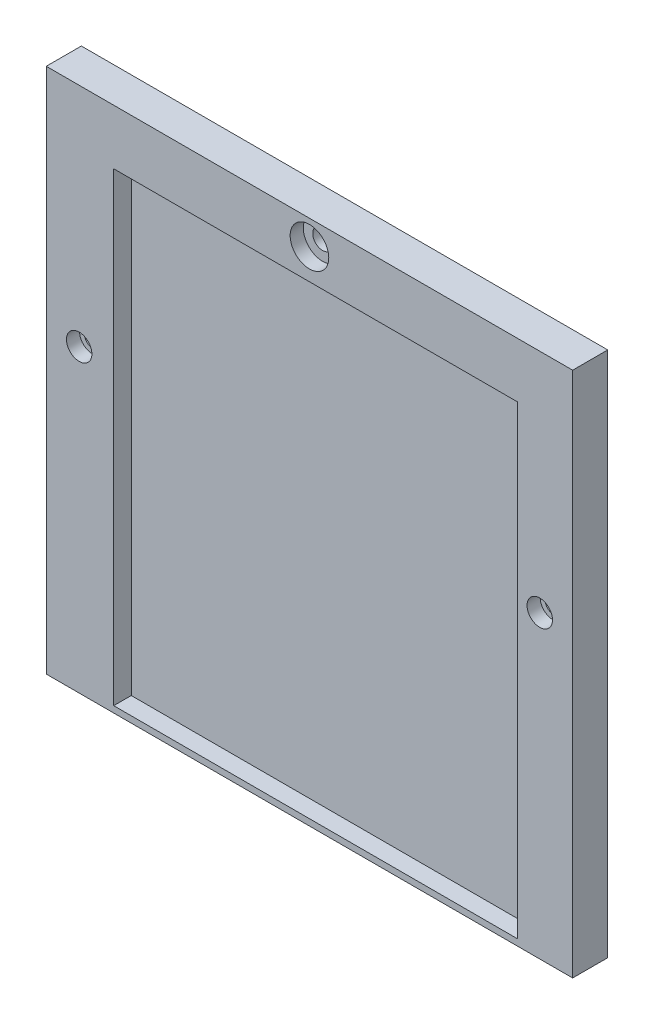
ISO-10303-21;
HEADER;
FILE_DESCRIPTION(('STEP AP214'),'2;1');
FILE_NAME('part.step','',(''),(''),'','','');
FILE_SCHEMA(('AUTOMOTIVE_DESIGN { 1 0 10303 214 1 1 1 1 }'));
ENDSEC;
DATA;
#1=APPLICATION_CONTEXT('core data for automotive mechanical design processes');
#2=APPLICATION_PROTOCOL_DEFINITION('international standard','automotive_design',2000,#1);
#3=PRODUCT_CONTEXT('',#1,'mechanical');
#4=PRODUCT('Part','Part','',(#3));
#5=PRODUCT_RELATED_PRODUCT_CATEGORY('part','',(#4));
#6=PRODUCT_DEFINITION_FORMATION('','',#4);
#7=PRODUCT_DEFINITION_CONTEXT('part definition',#1,'design');
#8=PRODUCT_DEFINITION('design','',#6,#7);
#9=PRODUCT_DEFINITION_SHAPE('','',#8);
#10=(LENGTH_UNIT() NAMED_UNIT(*) SI_UNIT(.MILLI.,.METRE.));
#11=(NAMED_UNIT(*) PLANE_ANGLE_UNIT() SI_UNIT($,.RADIAN.));
#12=(NAMED_UNIT(*) SI_UNIT($,.STERADIAN.) SOLID_ANGLE_UNIT());
#13=UNCERTAINTY_MEASURE_WITH_UNIT(LENGTH_MEASURE(1.E-05),#10,'distance_accuracy_value','');
#14=(GEOMETRIC_REPRESENTATION_CONTEXT(3) GLOBAL_UNCERTAINTY_ASSIGNED_CONTEXT((#13)) GLOBAL_UNIT_ASSIGNED_CONTEXT((#10,
#11,#12)) REPRESENTATION_CONTEXT('',''));
#15=CARTESIAN_POINT('',(0.,0.,0.));
#16=DIRECTION('',(0.,0.,1.));
#17=DIRECTION('',(1.,0.,0.));
#18=AXIS2_PLACEMENT_3D('',#15,#16,#17);
#19=CARTESIAN_POINT('',(-47.66,31.45,0.));
#20=DIRECTION('',(0.,0.,1.));
#21=DIRECTION('',(1.,0.,0.));
#22=AXIS2_PLACEMENT_3D('',#19,#20,#21);
#23=CYLINDRICAL_SURFACE('',#22,1.75);
#24=CARTESIAN_POINT('',(-47.66,31.45,0.));
#25=DIRECTION('',(0.,0.,1.));
#26=DIRECTION('',(1.,0.,0.));
#27=AXIS2_PLACEMENT_3D('',#24,#25,#26);
#28=CIRCLE('',#27,1.75);
#29=CARTESIAN_POINT('',(-45.91,31.45,0.));
#30=VERTEX_POINT('',#29);
#31=EDGE_CURVE('E159',#30,#30,#28,.T.);
#32=ORIENTED_EDGE('',*,*,#31,.F.);
#33=EDGE_LOOP('',(#32));
#34=FACE_BOUND('',#33,.T.);
#35=CARTESIAN_POINT('',(-47.66,31.45,5.));
#36=DIRECTION('',(0.,0.,1.));
#37=DIRECTION('',(1.,0.,0.));
#38=AXIS2_PLACEMENT_3D('',#35,#36,#37);
#39=CIRCLE('',#38,1.75);
#40=CARTESIAN_POINT('',(-45.91,31.45,5.));
#41=VERTEX_POINT('',#40);
#42=EDGE_CURVE('E43',#41,#41,#39,.F.);
#43=ORIENTED_EDGE('',*,*,#42,.F.);
#44=EDGE_LOOP('',(#43));
#45=FACE_BOUND('',#44,.T.);
#46=ADVANCED_FACE('F39',(#34,#45),#23,.F.);
#47=CARTESIAN_POINT('',(57.34,31.45,0.));
#48=DIRECTION('',(0.,0.,1.));
#49=DIRECTION('',(1.,0.,0.));
#50=AXIS2_PLACEMENT_3D('',#47,#48,#49);
#51=CYLINDRICAL_SURFACE('',#50,1.75);
#52=CARTESIAN_POINT('',(57.34,31.45,0.));
#53=DIRECTION('',(0.,0.,1.));
#54=DIRECTION('',(1.,0.,0.));
#55=AXIS2_PLACEMENT_3D('',#52,#53,#54);
#56=CIRCLE('',#55,1.75);
#57=CARTESIAN_POINT('',(59.09,31.45,0.));
#58=VERTEX_POINT('',#57);
#59=EDGE_CURVE('E169',#58,#58,#56,.T.);
#60=ORIENTED_EDGE('',*,*,#59,.F.);
#61=EDGE_LOOP('',(#60));
#62=FACE_BOUND('',#61,.T.);
#63=CARTESIAN_POINT('',(57.34,31.45,5.));
#64=DIRECTION('',(0.,0.,1.));
#65=DIRECTION('',(1.,0.,0.));
#66=AXIS2_PLACEMENT_3D('',#63,#64,#65);
#67=CIRCLE('',#66,1.75);
#68=CARTESIAN_POINT('',(59.09,31.45,5.));
#69=VERTEX_POINT('',#68);
#70=EDGE_CURVE('E166',#69,#69,#67,.F.);
#71=ORIENTED_EDGE('',*,*,#70,.F.);
#72=EDGE_LOOP('',(#71));
#73=FACE_BOUND('',#72,.T.);
#74=ADVANCED_FACE('F208',(#62,#73),#51,.F.);
#75=CARTESIAN_POINT('',(4.83805461554325,77.4543242444479,0.));
#76=DIRECTION('',(0.,0.,1.));
#77=DIRECTION('',(1.,0.,0.));
#78=AXIS2_PLACEMENT_3D('',#75,#76,#77);
#79=CYLINDRICAL_SURFACE('',#78,2.25);
#80=CARTESIAN_POINT('',(4.83805461554325,77.4543242444479,0.));
#81=DIRECTION('',(0.,0.,1.));
#82=DIRECTION('',(1.,0.,0.));
#83=AXIS2_PLACEMENT_3D('',#80,#81,#82);
#84=CIRCLE('',#83,2.25);
#85=CARTESIAN_POINT('',(7.08805461554325,77.4543242444479,0.));
#86=VERTEX_POINT('',#85);
#87=EDGE_CURVE('E179',#86,#86,#84,.T.);
#88=ORIENTED_EDGE('',*,*,#87,.F.);
#89=EDGE_LOOP('',(#88));
#90=FACE_BOUND('',#89,.T.);
#91=CARTESIAN_POINT('',(4.83805461554325,77.4543242444479,5.));
#92=DIRECTION('',(0.,0.,1.));
#93=DIRECTION('',(1.,0.,0.));
#94=AXIS2_PLACEMENT_3D('',#91,#92,#93);
#95=CIRCLE('',#94,2.25);
#96=CARTESIAN_POINT('',(7.08805461554325,77.4543242444479,5.));
#97=VERTEX_POINT('',#96);
#98=EDGE_CURVE('E176',#97,#97,#95,.F.);
#99=ORIENTED_EDGE('',*,*,#98,.F.);
#100=EDGE_LOOP('',(#99));
#101=FACE_BOUND('',#100,.T.);
#102=ADVANCED_FACE('F210',(#90,#101),#79,.F.);
#103=CARTESIAN_POINT('',(-55.1619453844568,83.0726511795082,8.));
#104=DIRECTION('',(1.,0.,0.));
#105=DIRECTION('',(0.,1.,0.));
#106=AXIS2_PLACEMENT_3D('',#103,#104,#105);
#107=PLANE('',#106);
#108=DIRECTION('',(0.,-1.,0.));
#109=VECTOR('',#108,1.);
#110=CARTESIAN_POINT('',(-55.1619453844568,83.0726511795082,0.));
#111=LINE('',#110,#109);
#112=CARTESIAN_POINT('',(-55.1619453844568,83.0726511795082,0.));
#113=VERTEX_POINT('',#112);
#114=CARTESIAN_POINT('',(-55.1619453844567,-36.9273488204918,0.));
#115=VERTEX_POINT('',#114);
#116=EDGE_CURVE('E182',#113,#115,#111,.T.);
#117=ORIENTED_EDGE('',*,*,#116,.T.);
#118=DIRECTION('',(0.,0.,-1.));
#119=VECTOR('',#118,1.);
#120=CARTESIAN_POINT('',(-55.1619453844567,-36.9273488204918,8.));
#121=LINE('',#120,#119);
#122=CARTESIAN_POINT('',(-55.1619453844567,-36.9273488204918,8.));
#123=VERTEX_POINT('',#122);
#124=EDGE_CURVE('E11',#123,#115,#121,.T.);
#125=ORIENTED_EDGE('',*,*,#124,.F.);
#126=DIRECTION('',(0.,-1.,0.));
#127=VECTOR('',#126,1.);
#128=CARTESIAN_POINT('',(-55.1619453844568,83.0726511795082,8.));
#129=LINE('',#128,#127);
#130=CARTESIAN_POINT('',(-55.1619453844568,83.0726511795082,8.));
#131=VERTEX_POINT('',#130);
#132=EDGE_CURVE('E183',#131,#123,#129,.T.);
#133=ORIENTED_EDGE('',*,*,#132,.F.);
#134=DIRECTION('',(0.,0.,-1.));
#135=VECTOR('',#134,1.);
#136=CARTESIAN_POINT('',(-55.1619453844568,83.0726511795082,8.));
#137=LINE('',#136,#135);
#138=EDGE_CURVE('E189',#131,#113,#137,.T.);
#139=ORIENTED_EDGE('',*,*,#138,.T.);
#140=EDGE_LOOP('',(#117,#125,#133,#139));
#141=FACE_BOUND('',#140,.T.);
#142=ADVANCED_FACE('F41',(#141),#107,.F.);
#143=CARTESIAN_POINT('',(-55.1619453844567,-36.9273488204918,8.));
#144=DIRECTION('',(0.,1.,0.));
#145=DIRECTION('',(0.,0.,1.));
#146=AXIS2_PLACEMENT_3D('',#143,#144,#145);
#147=PLANE('',#146);
#148=DIRECTION('',(1.,0.,0.));
#149=VECTOR('',#148,1.);
#150=CARTESIAN_POINT('',(-55.1619453844567,-36.9273488204918,0.));
#151=LINE('',#150,#149);
#152=CARTESIAN_POINT('',(64.8380546155433,-36.9273488204918,0.));
#153=VERTEX_POINT('',#152);
#154=EDGE_CURVE('E192',#115,#153,#151,.T.);
#155=ORIENTED_EDGE('',*,*,#154,.T.);
#156=DIRECTION('',(0.,0.,-1.));
#157=VECTOR('',#156,1.);
#158=CARTESIAN_POINT('',(64.8380546155433,-36.9273488204918,8.));
#159=LINE('',#158,#157);
#160=CARTESIAN_POINT('',(64.8380546155433,-36.9273488204918,8.));
#161=VERTEX_POINT('',#160);
#162=EDGE_CURVE('E48',#161,#153,#159,.T.);
#163=ORIENTED_EDGE('',*,*,#162,.F.);
#164=DIRECTION('',(1.,0.,0.));
#165=VECTOR('',#164,1.);
#166=CARTESIAN_POINT('',(-55.1619453844567,-36.9273488204918,8.));
#167=LINE('',#166,#165);
#168=EDGE_CURVE('E93',#123,#161,#167,.T.);
#169=ORIENTED_EDGE('',*,*,#168,.F.);
#170=ORIENTED_EDGE('',*,*,#124,.T.);
#171=EDGE_LOOP('',(#155,#163,#169,#170));
#172=FACE_BOUND('',#171,.T.);
#173=ADVANCED_FACE('F248',(#172),#147,.F.);
#174=CARTESIAN_POINT('',(64.8380546155432,83.0726511795082,8.));
#175=DIRECTION('',(-1.,0.,0.));
#176=DIRECTION('',(0.,-1.,0.));
#177=AXIS2_PLACEMENT_3D('',#174,#175,#176);
#178=PLANE('',#177);
#179=DIRECTION('',(0.,1.,0.));
#180=VECTOR('',#179,1.);
#181=CARTESIAN_POINT('',(64.8380546155432,83.0726511795082,0.));
#182=LINE('',#181,#180);
#183=CARTESIAN_POINT('',(64.8380546155432,83.0726511795082,0.));
#184=VERTEX_POINT('',#183);
#185=EDGE_CURVE('E194',#153,#184,#182,.T.);
#186=ORIENTED_EDGE('',*,*,#185,.T.);
#187=DIRECTION('',(0.,0.,-1.));
#188=VECTOR('',#187,1.);
#189=CARTESIAN_POINT('',(64.8380546155432,83.0726511795082,8.));
#190=LINE('',#189,#188);
#191=CARTESIAN_POINT('',(64.8380546155432,83.0726511795082,8.));
#192=VERTEX_POINT('',#191);
#193=EDGE_CURVE('E198',#192,#184,#190,.T.);
#194=ORIENTED_EDGE('',*,*,#193,.F.);
#195=DIRECTION('',(0.,1.,0.));
#196=VECTOR('',#195,1.);
#197=CARTESIAN_POINT('',(64.8380546155432,83.0726511795082,8.));
#198=LINE('',#197,#196);
#199=EDGE_CURVE('E186',#161,#192,#198,.T.);
#200=ORIENTED_EDGE('',*,*,#199,.F.);
#201=ORIENTED_EDGE('',*,*,#162,.T.);
#202=EDGE_LOOP('',(#186,#194,#200,#201));
#203=FACE_BOUND('',#202,.T.);
#204=ADVANCED_FACE('F246',(#203),#178,.F.);
#205=CARTESIAN_POINT('',(-55.1619453844568,83.0726511795082,8.));
#206=DIRECTION('',(0.,-1.,0.));
#207=DIRECTION('',(0.,0.,-1.));
#208=AXIS2_PLACEMENT_3D('',#205,#206,#207);
#209=PLANE('',#208);
#210=DIRECTION('',(-1.,0.,0.));
#211=VECTOR('',#210,1.);
#212=CARTESIAN_POINT('',(-55.1619453844568,83.0726511795082,0.));
#213=LINE('',#212,#211);
#214=EDGE_CURVE('E86',#184,#113,#213,.T.);
#215=ORIENTED_EDGE('',*,*,#214,.T.);
#216=ORIENTED_EDGE('',*,*,#138,.F.);
#217=DIRECTION('',(-1.,0.,0.));
#218=VECTOR('',#217,1.);
#219=CARTESIAN_POINT('',(-55.1619453844568,83.0726511795082,8.));
#220=LINE('',#219,#218);
#221=EDGE_CURVE('E65',#192,#131,#220,.T.);
#222=ORIENTED_EDGE('',*,*,#221,.F.);
#223=ORIENTED_EDGE('',*,*,#193,.T.);
#224=EDGE_LOOP('',(#215,#216,#222,#223));
#225=FACE_BOUND('',#224,.T.);
#226=ADVANCED_FACE('F239',(#225),#209,.F.);
#227=CARTESIAN_POINT('',(0.,0.,8.));
#228=DIRECTION('',(0.,0.,1.));
#229=DIRECTION('',(1.,0.,0.));
#230=AXIS2_PLACEMENT_3D('',#227,#228,#229);
#231=PLANE('',#230);
#232=DIRECTION('',(1.,0.,0.));
#233=VECTOR('',#232,1.);
#234=CARTESIAN_POINT('',(-39.7844067643749,-35.4734787351645,8.));
#235=LINE('',#234,#233);
#236=CARTESIAN_POINT('',(-39.7844067643749,-35.4734787351645,8.));
#237=VERTEX_POINT('',#236);
#238=CARTESIAN_POINT('',(52.2155932356251,-35.4734787351645,8.));
#239=VERTEX_POINT('',#238);
#240=EDGE_CURVE('E56',#237,#239,#235,.T.);
#241=ORIENTED_EDGE('',*,*,#240,.F.);
#242=DIRECTION('',(0.,-1.,0.));
#243=VECTOR('',#242,1.);
#244=CARTESIAN_POINT('',(-39.784406764375,70.5265212648355,8.));
#245=LINE('',#244,#243);
#246=CARTESIAN_POINT('',(-39.784406764375,70.5265212648355,8.));
#247=VERTEX_POINT('',#246);
#248=EDGE_CURVE('E135',#247,#237,#245,.T.);
#249=ORIENTED_EDGE('',*,*,#248,.F.);
#250=DIRECTION('',(1.,0.,0.));
#251=VECTOR('',#250,1.);
#252=CARTESIAN_POINT('',(-39.784406764375,70.5265212648355,8.));
#253=LINE('',#252,#251);
#254=CARTESIAN_POINT('',(52.215593235625,70.5265212648355,8.));
#255=VERTEX_POINT('',#254);
#256=EDGE_CURVE('E138',#247,#255,#253,.T.);
#257=ORIENTED_EDGE('',*,*,#256,.T.);
#258=DIRECTION('',(0.,-1.,0.));
#259=VECTOR('',#258,1.);
#260=CARTESIAN_POINT('',(52.215593235625,70.5265212648355,8.));
#261=LINE('',#260,#259);
#262=EDGE_CURVE('E144',#255,#239,#261,.T.);
#263=ORIENTED_EDGE('',*,*,#262,.T.);
#264=EDGE_LOOP('',(#241,#249,#257,#263));
#265=FACE_BOUND('',#264,.T.);
#266=CARTESIAN_POINT('',(-47.66,31.45,8.));
#267=DIRECTION('',(0.,0.,1.));
#268=DIRECTION('',(1.,0.,0.));
#269=AXIS2_PLACEMENT_3D('',#266,#267,#268);
#270=CIRCLE('',#269,2.9);
#271=CARTESIAN_POINT('',(-44.76,31.45,8.));
#272=VERTEX_POINT('',#271);
#273=EDGE_CURVE('E150',#272,#272,#270,.T.);
#274=ORIENTED_EDGE('',*,*,#273,.F.);
#275=EDGE_LOOP('',(#274));
#276=FACE_BOUND('',#275,.T.);
#277=CARTESIAN_POINT('',(57.34,31.45,8.));
#278=DIRECTION('',(0.,0.,1.));
#279=DIRECTION('',(1.,0.,0.));
#280=AXIS2_PLACEMENT_3D('',#277,#278,#279);
#281=CIRCLE('',#280,2.9);
#282=CARTESIAN_POINT('',(60.24,31.45,8.));
#283=VERTEX_POINT('',#282);
#284=EDGE_CURVE('E162',#283,#283,#281,.T.);
#285=ORIENTED_EDGE('',*,*,#284,.F.);
#286=EDGE_LOOP('',(#285));
#287=FACE_BOUND('',#286,.T.);
#288=CARTESIAN_POINT('',(4.83805461554325,77.4543242444479,8.));
#289=DIRECTION('',(0.,0.,1.));
#290=DIRECTION('',(1.,0.,0.));
#291=AXIS2_PLACEMENT_3D('',#288,#289,#290);
#292=CIRCLE('',#291,4.4);
#293=CARTESIAN_POINT('',(9.23805461554325,77.4543242444479,8.));
#294=VERTEX_POINT('',#293);
#295=EDGE_CURVE('E172',#294,#294,#292,.T.);
#296=ORIENTED_EDGE('',*,*,#295,.F.);
#297=EDGE_LOOP('',(#296));
#298=FACE_BOUND('',#297,.T.);
#299=ORIENTED_EDGE('',*,*,#132,.T.);
#300=ORIENTED_EDGE('',*,*,#168,.T.);
#301=ORIENTED_EDGE('',*,*,#199,.T.);
#302=ORIENTED_EDGE('',*,*,#221,.T.);
#303=EDGE_LOOP('',(#299,#300,#301,#302));
#304=FACE_BOUND('',#303,.T.);
#305=ADVANCED_FACE('F236',(#265,#276,#287,#298,#304),#231,.T.);
#306=CARTESIAN_POINT('',(0.,0.,0.));
#307=DIRECTION('',(0.,0.,1.));
#308=DIRECTION('',(1.,0.,0.));
#309=AXIS2_PLACEMENT_3D('',#306,#307,#308);
#310=PLANE('',#309);
#311=ORIENTED_EDGE('',*,*,#31,.T.);
#312=EDGE_LOOP('',(#311));
#313=FACE_BOUND('',#312,.T.);
#314=ORIENTED_EDGE('',*,*,#59,.T.);
#315=EDGE_LOOP('',(#314));
#316=FACE_BOUND('',#315,.T.);
#317=ORIENTED_EDGE('',*,*,#87,.T.);
#318=EDGE_LOOP('',(#317));
#319=FACE_BOUND('',#318,.T.);
#320=ORIENTED_EDGE('',*,*,#116,.F.);
#321=ORIENTED_EDGE('',*,*,#214,.F.);
#322=ORIENTED_EDGE('',*,*,#185,.F.);
#323=ORIENTED_EDGE('',*,*,#154,.F.);
#324=EDGE_LOOP('',(#320,#321,#322,#323));
#325=FACE_BOUND('',#324,.T.);
#326=ADVANCED_FACE('F232',(#313,#316,#319,#325),#310,.F.);
#327=CARTESIAN_POINT('',(4.83805461554325,77.4543242444479,5.));
#328=DIRECTION('',(0.,0.,1.));
#329=DIRECTION('',(1.,0.,0.));
#330=AXIS2_PLACEMENT_3D('',#327,#328,#329);
#331=PLANE('',#330);
#332=CARTESIAN_POINT('',(4.83805461554325,77.4543242444479,5.));
#333=DIRECTION('',(0.,0.,1.));
#334=DIRECTION('',(1.,0.,0.));
#335=AXIS2_PLACEMENT_3D('',#332,#333,#334);
#336=CIRCLE('',#335,4.4);
#337=CARTESIAN_POINT('',(9.23805461554325,77.4543242444479,5.));
#338=VERTEX_POINT('',#337);
#339=EDGE_CURVE('E173',#338,#338,#336,.T.);
#340=ORIENTED_EDGE('',*,*,#339,.T.);
#341=EDGE_LOOP('',(#340));
#342=FACE_BOUND('',#341,.T.);
#343=ORIENTED_EDGE('',*,*,#98,.T.);
#344=EDGE_LOOP('',(#343));
#345=FACE_BOUND('',#344,.T.);
#346=ADVANCED_FACE('F228',(#342,#345),#331,.T.);
#347=CARTESIAN_POINT('',(4.83805461554325,77.4543242444479,5.));
#348=DIRECTION('',(0.,0.,1.));
#349=DIRECTION('',(1.,0.,0.));
#350=AXIS2_PLACEMENT_3D('',#347,#348,#349);
#351=CYLINDRICAL_SURFACE('',#350,4.4);
#352=ORIENTED_EDGE('',*,*,#339,.F.);
#353=EDGE_LOOP('',(#352));
#354=FACE_BOUND('',#353,.T.);
#355=ORIENTED_EDGE('',*,*,#295,.T.);
#356=EDGE_LOOP('',(#355));
#357=FACE_BOUND('',#356,.T.);
#358=ADVANCED_FACE('F231',(#354,#357),#351,.F.);
#359=CARTESIAN_POINT('',(57.34,31.45,5.));
#360=DIRECTION('',(0.,0.,1.));
#361=DIRECTION('',(1.,0.,0.));
#362=AXIS2_PLACEMENT_3D('',#359,#360,#361);
#363=PLANE('',#362);
#364=CARTESIAN_POINT('',(57.34,31.45,5.));
#365=DIRECTION('',(0.,0.,1.));
#366=DIRECTION('',(1.,0.,0.));
#367=AXIS2_PLACEMENT_3D('',#364,#365,#366);
#368=CIRCLE('',#367,2.9);
#369=CARTESIAN_POINT('',(60.24,31.45,5.));
#370=VERTEX_POINT('',#369);
#371=EDGE_CURVE('E163',#370,#370,#368,.T.);
#372=ORIENTED_EDGE('',*,*,#371,.T.);
#373=EDGE_LOOP('',(#372));
#374=FACE_BOUND('',#373,.T.);
#375=ORIENTED_EDGE('',*,*,#70,.T.);
#376=EDGE_LOOP('',(#375));
#377=FACE_BOUND('',#376,.T.);
#378=ADVANCED_FACE('F206',(#374,#377),#363,.T.);
#379=CARTESIAN_POINT('',(57.34,31.45,5.));
#380=DIRECTION('',(0.,0.,1.));
#381=DIRECTION('',(1.,0.,0.));
#382=AXIS2_PLACEMENT_3D('',#379,#380,#381);
#383=CYLINDRICAL_SURFACE('',#382,2.9);
#384=ORIENTED_EDGE('',*,*,#371,.F.);
#385=EDGE_LOOP('',(#384));
#386=FACE_BOUND('',#385,.T.);
#387=ORIENTED_EDGE('',*,*,#284,.T.);
#388=EDGE_LOOP('',(#387));
#389=FACE_BOUND('',#388,.T.);
#390=ADVANCED_FACE('F226',(#386,#389),#383,.F.);
#391=CARTESIAN_POINT('',(-47.66,31.45,5.));
#392=DIRECTION('',(0.,0.,1.));
#393=DIRECTION('',(1.,0.,0.));
#394=AXIS2_PLACEMENT_3D('',#391,#392,#393);
#395=PLANE('',#394);
#396=CARTESIAN_POINT('',(-47.66,31.45,5.));
#397=DIRECTION('',(0.,0.,1.));
#398=DIRECTION('',(1.,0.,0.));
#399=AXIS2_PLACEMENT_3D('',#396,#397,#398);
#400=CIRCLE('',#399,2.9);
#401=CARTESIAN_POINT('',(-44.76,31.45,5.));
#402=VERTEX_POINT('',#401);
#403=EDGE_CURVE('E154',#402,#402,#400,.T.);
#404=ORIENTED_EDGE('',*,*,#403,.T.);
#405=EDGE_LOOP('',(#404));
#406=FACE_BOUND('',#405,.T.);
#407=ORIENTED_EDGE('',*,*,#42,.T.);
#408=EDGE_LOOP('',(#407));
#409=FACE_BOUND('',#408,.T.);
#410=ADVANCED_FACE('F332',(#406,#409),#395,.T.);
#411=CARTESIAN_POINT('',(-47.66,31.45,5.));
#412=DIRECTION('',(0.,0.,1.));
#413=DIRECTION('',(1.,0.,0.));
#414=AXIS2_PLACEMENT_3D('',#411,#412,#413);
#415=CYLINDRICAL_SURFACE('',#414,2.9);
#416=ORIENTED_EDGE('',*,*,#403,.F.);
#417=EDGE_LOOP('',(#416));
#418=FACE_BOUND('',#417,.T.);
#419=ORIENTED_EDGE('',*,*,#273,.T.);
#420=EDGE_LOOP('',(#419));
#421=FACE_BOUND('',#420,.T.);
#422=ADVANCED_FACE('F346',(#418,#421),#415,.F.);
#423=CARTESIAN_POINT('',(-39.7844067643749,-35.4734787351645,4.));
#424=DIRECTION('',(0.,-1.,0.));
#425=DIRECTION('',(0.,0.,-1.));
#426=AXIS2_PLACEMENT_3D('',#423,#424,#425);
#427=PLANE('',#426);
#428=ORIENTED_EDGE('',*,*,#240,.T.);
#429=DIRECTION('',(0.,0.,1.));
#430=VECTOR('',#429,1.);
#431=CARTESIAN_POINT('',(52.2155932356251,-35.4734787351645,4.));
#432=LINE('',#431,#430);
#433=CARTESIAN_POINT('',(52.2155932356251,-35.4734787351645,4.));
#434=VERTEX_POINT('',#433);
#435=EDGE_CURVE('E119',#434,#239,#432,.T.);
#436=ORIENTED_EDGE('',*,*,#435,.F.);
#437=DIRECTION('',(1.,0.,0.));
#438=VECTOR('',#437,1.);
#439=CARTESIAN_POINT('',(-39.7844067643749,-35.4734787351645,4.));
#440=LINE('',#439,#438);
#441=CARTESIAN_POINT('',(-39.7844067643749,-35.4734787351645,4.));
#442=VERTEX_POINT('',#441);
#443=EDGE_CURVE('E126',#442,#434,#440,.T.);
#444=ORIENTED_EDGE('',*,*,#443,.F.);
#445=DIRECTION('',(0.,0.,1.));
#446=VECTOR('',#445,1.);
#447=CARTESIAN_POINT('',(-39.7844067643749,-35.4734787351645,4.));
#448=LINE('',#447,#446);
#449=EDGE_CURVE('E148',#442,#237,#448,.T.);
#450=ORIENTED_EDGE('',*,*,#449,.T.);
#451=EDGE_LOOP('',(#428,#436,#444,#450));
#452=FACE_BOUND('',#451,.T.);
#453=ADVANCED_FACE('F129',(#452),#427,.F.);
#454=CARTESIAN_POINT('',(-39.784406764375,70.5265212648355,4.));
#455=DIRECTION('',(-1.,0.,0.));
#456=DIRECTION('',(0.,-1.,0.));
#457=AXIS2_PLACEMENT_3D('',#454,#455,#456);
#458=PLANE('',#457);
#459=ORIENTED_EDGE('',*,*,#248,.T.);
#460=ORIENTED_EDGE('',*,*,#449,.F.);
#461=DIRECTION('',(0.,-1.,0.));
#462=VECTOR('',#461,1.);
#463=CARTESIAN_POINT('',(-39.784406764375,70.5265212648355,4.));
#464=LINE('',#463,#462);
#465=CARTESIAN_POINT('',(-39.784406764375,70.5265212648355,4.));
#466=VERTEX_POINT('',#465);
#467=EDGE_CURVE('E131',#466,#442,#464,.T.);
#468=ORIENTED_EDGE('',*,*,#467,.F.);
#469=DIRECTION('',(0.,0.,1.));
#470=VECTOR('',#469,1.);
#471=CARTESIAN_POINT('',(-39.784406764375,70.5265212648355,4.));
#472=LINE('',#471,#470);
#473=EDGE_CURVE('E151',#466,#247,#472,.T.);
#474=ORIENTED_EDGE('',*,*,#473,.T.);
#475=EDGE_LOOP('',(#459,#460,#468,#474));
#476=FACE_BOUND('',#475,.T.);
#477=ADVANCED_FACE('F363',(#476),#458,.F.);
#478=CARTESIAN_POINT('',(-39.784406764375,70.5265212648355,4.));
#479=DIRECTION('',(0.,-1.,0.));
#480=DIRECTION('',(0.,0.,-1.));
#481=AXIS2_PLACEMENT_3D('',#478,#479,#480);
#482=PLANE('',#481);
#483=ORIENTED_EDGE('',*,*,#256,.F.);
#484=ORIENTED_EDGE('',*,*,#473,.F.);
#485=DIRECTION('',(1.,0.,0.));
#486=VECTOR('',#485,1.);
#487=CARTESIAN_POINT('',(-39.784406764375,70.5265212648355,4.));
#488=LINE('',#487,#486);
#489=CARTESIAN_POINT('',(52.215593235625,70.5265212648355,4.));
#490=VERTEX_POINT('',#489);
#491=EDGE_CURVE('E125',#466,#490,#488,.T.);
#492=ORIENTED_EDGE('',*,*,#491,.T.);
#493=DIRECTION('',(0.,0.,1.));
#494=VECTOR('',#493,1.);
#495=CARTESIAN_POINT('',(52.215593235625,70.5265212648355,4.));
#496=LINE('',#495,#494);
#497=EDGE_CURVE('E121',#490,#255,#496,.T.);
#498=ORIENTED_EDGE('',*,*,#497,.T.);
#499=EDGE_LOOP('',(#483,#484,#492,#498));
#500=FACE_BOUND('',#499,.T.);
#501=ADVANCED_FACE('F372',(#500),#482,.T.);
#502=CARTESIAN_POINT('',(52.215593235625,70.5265212648355,4.));
#503=DIRECTION('',(-1.,0.,0.));
#504=DIRECTION('',(0.,-1.,0.));
#505=AXIS2_PLACEMENT_3D('',#502,#503,#504);
#506=PLANE('',#505);
#507=ORIENTED_EDGE('',*,*,#262,.F.);
#508=ORIENTED_EDGE('',*,*,#497,.F.);
#509=DIRECTION('',(0.,-1.,0.));
#510=VECTOR('',#509,1.);
#511=CARTESIAN_POINT('',(52.215593235625,70.5265212648355,4.));
#512=LINE('',#511,#510);
#513=EDGE_CURVE('E116',#490,#434,#512,.T.);
#514=ORIENTED_EDGE('',*,*,#513,.T.);
#515=ORIENTED_EDGE('',*,*,#435,.T.);
#516=EDGE_LOOP('',(#507,#508,#514,#515));
#517=FACE_BOUND('',#516,.T.);
#518=ADVANCED_FACE('F118',(#517),#506,.T.);
#519=CARTESIAN_POINT('',(0.,0.,4.));
#520=DIRECTION('',(0.,0.,-1.));
#521=DIRECTION('',(-1.,0.,0.));
#522=AXIS2_PLACEMENT_3D('',#519,#520,#521);
#523=PLANE('',#522);
#524=ORIENTED_EDGE('',*,*,#443,.T.);
#525=ORIENTED_EDGE('',*,*,#513,.F.);
#526=ORIENTED_EDGE('',*,*,#491,.F.);
#527=ORIENTED_EDGE('',*,*,#467,.T.);
#528=EDGE_LOOP('',(#524,#525,#526,#527));
#529=FACE_BOUND('',#528,.T.);
#530=ADVANCED_FACE('F133',(#529),#523,.F.);
#531=CLOSED_SHELL('',(#46,#74,#102,#142,#173,#204,#226,#305,#326,#346,#358,#378,#390,#410,#422,
#453,#477,#501,#518,#530));
#532=MANIFOLD_SOLID_BREP('B2',#531);
#533=ADVANCED_BREP_SHAPE_REPRESENTATION('',(#18,#532),#14);
#534=SHAPE_DEFINITION_REPRESENTATION(#9,#533);
ENDSEC;
END-ISO-10303-21;
